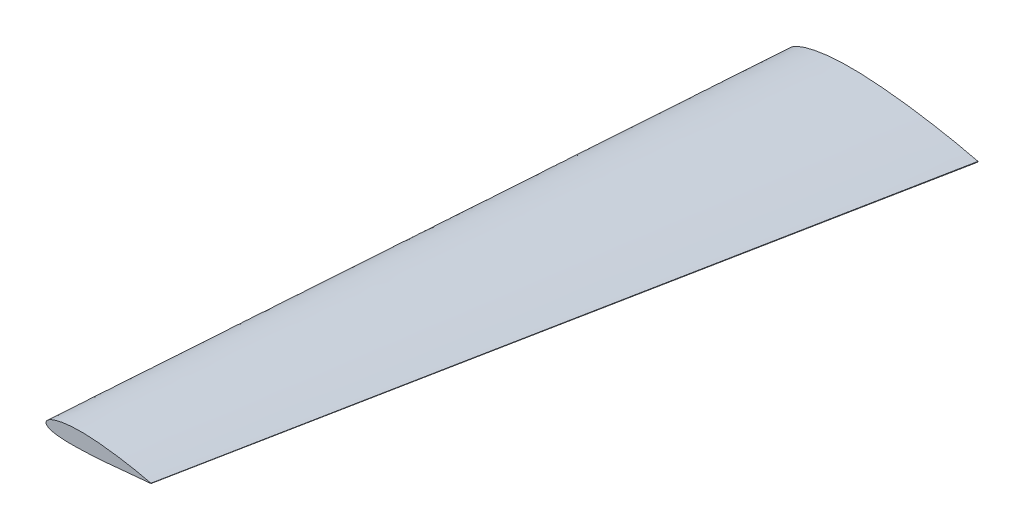
ISO-10303-21;
HEADER;
FILE_DESCRIPTION(('STEP AP214'),'2;1');
FILE_NAME('part.step','',(''),(''),'','','');
FILE_SCHEMA(('AUTOMOTIVE_DESIGN { 1 0 10303 214 1 1 1 1 }'));
ENDSEC;
DATA;
#1=APPLICATION_CONTEXT('core data for automotive mechanical design processes');
#2=APPLICATION_PROTOCOL_DEFINITION('international standard','automotive_design',2000,#1);
#3=PRODUCT_CONTEXT('',#1,'mechanical');
#4=PRODUCT('Part','Part','',(#3));
#5=PRODUCT_RELATED_PRODUCT_CATEGORY('part','',(#4));
#6=PRODUCT_DEFINITION_FORMATION('','',#4);
#7=PRODUCT_DEFINITION_CONTEXT('part definition',#1,'design');
#8=PRODUCT_DEFINITION('design','',#6,#7);
#9=PRODUCT_DEFINITION_SHAPE('','',#8);
#10=(LENGTH_UNIT() NAMED_UNIT(*) SI_UNIT(.MILLI.,.METRE.));
#11=(NAMED_UNIT(*) PLANE_ANGLE_UNIT() SI_UNIT($,.RADIAN.));
#12=(NAMED_UNIT(*) SI_UNIT($,.STERADIAN.) SOLID_ANGLE_UNIT());
#13=UNCERTAINTY_MEASURE_WITH_UNIT(LENGTH_MEASURE(1.E-05),#10,'distance_accuracy_value','');
#14=(GEOMETRIC_REPRESENTATION_CONTEXT(3) GLOBAL_UNCERTAINTY_ASSIGNED_CONTEXT((#13)) GLOBAL_UNIT_ASSIGNED_CONTEXT((#10,
#11,#12)) REPRESENTATION_CONTEXT('',''));
#15=CARTESIAN_POINT('',(0.,0.,0.));
#16=DIRECTION('',(0.,0.,1.));
#17=DIRECTION('',(1.,0.,0.));
#18=AXIS2_PLACEMENT_3D('',#15,#16,#17);
#19=CARTESIAN_POINT('',(0.48529419488582,365.778243503538,4397.25));
#20=DIRECTION('',(0.,0.,-1.));
#21=DIRECTION('',(-1.,0.,0.));
#22=AXIS2_PLACEMENT_3D('',#19,#20,#21);
#23=PLANE('',#22);
#24=CARTESIAN_POINT('',(622.134000000001,361.154223854971,4397.25));
#25=CARTESIAN_POINT('',(621.59500734069,361.291859580465,4397.25));
#26=CARTESIAN_POINT('',(619.381494170329,361.857096389966,4397.25));
#27=CARTESIAN_POINT('',(614.378129432396,363.041959537774,4397.25));
#28=CARTESIAN_POINT('',(606.075965268699,365.041083084075,4397.25));
#29=CARTESIAN_POINT('',(594.562264688442,367.717976295112,4397.25));
#30=CARTESIAN_POINT('',(579.962372665304,371.020420206426,4397.25));
#31=CARTESIAN_POINT('',(562.428500263694,374.855164539315,4397.25));
#32=CARTESIAN_POINT('',(542.135841126099,379.082208316108,4397.25));
#33=CARTESIAN_POINT('',(519.304194537753,383.62313166061,4397.25));
#34=CARTESIAN_POINT('',(494.169690467529,388.330326508768,4397.25));
#35=CARTESIAN_POINT('',(467.003877408074,393.100479443047,4397.25));
#36=CARTESIAN_POINT('',(438.094281483804,397.79844159247,4397.25));
#37=CARTESIAN_POINT('',(407.756068130465,402.314610897269,4397.25));
#38=CARTESIAN_POINT('',(376.319826163633,406.523489806815,4397.25));
#39=CARTESIAN_POINT('',(344.131445540233,410.303703800402,4397.25));
#40=CARTESIAN_POINT('',(311.544482249428,413.555543350783,4397.25));
#41=CARTESIAN_POINT('',(278.910738081519,416.139019252054,4397.25));
#42=CARTESIAN_POINT('',(246.501883794256,418.018501255716,4397.25));
#43=CARTESIAN_POINT('',(214.670723074633,418.896439526605,4397.25));
#44=CARTESIAN_POINT('',(183.801726544895,418.655393508333,4397.25));
#45=CARTESIAN_POINT('',(154.355746136456,417.28073558469,4397.25));
#46=CARTESIAN_POINT('',(126.687396080654,414.815292792805,4397.25));
#47=CARTESIAN_POINT('',(101.122470154931,411.297841187899,4397.25));
#48=CARTESIAN_POINT('',(77.9562016397153,406.856899629141,4397.25));
#49=CARTESIAN_POINT('',(57.4552363090071,401.589993813645,4397.25));
#50=CARTESIAN_POINT('',(39.8290080744428,395.684888103957,4397.25));
#51=CARTESIAN_POINT('',(25.261931616876,389.262183209037,4397.25));
#52=CARTESIAN_POINT('',(13.8438969541932,382.491049697927,4397.25));
#53=CARTESIAN_POINT('',(5.62698924721451,375.445923983102,4397.25));
#54=CARTESIAN_POINT('',(0.604435184205734,368.009060610981,4397.25));
#55=CARTESIAN_POINT('',(-0.636500063416992,360.113178532751,4397.25));
#56=CARTESIAN_POINT('',(2.14402148250149,352.638117238405,4397.25));
#57=CARTESIAN_POINT('',(8.44622146363984,346.322275084812,4397.25));
#58=CARTESIAN_POINT('',(17.7212545167051,340.955489601626,4397.25));
#59=CARTESIAN_POINT('',(29.9494081327897,336.346258667545,4397.25));
#60=CARTESIAN_POINT('',(45.0565133443111,332.488254081348,4397.25));
#61=CARTESIAN_POINT('',(62.9110788027417,329.393215308733,4397.25));
#62=CARTESIAN_POINT('',(83.3338784297079,327.08523582686,4397.25));
#63=CARTESIAN_POINT('',(106.114763475348,325.541414517062,4397.25));
#64=CARTESIAN_POINT('',(131.020950152935,324.734956705274,4397.25));
#65=CARTESIAN_POINT('',(157.805963808211,324.601804228612,4397.25));
#66=CARTESIAN_POINT('',(186.202065047431,325.066195101839,4397.25));
#67=CARTESIAN_POINT('',(215.928239761478,326.025854938204,4397.25));
#68=CARTESIAN_POINT('',(246.78699261797,327.346889225526,4397.25));
#69=CARTESIAN_POINT('',(278.467503295217,328.994699280183,4397.25));
#70=CARTESIAN_POINT('',(310.630418049569,331.06306279554,4397.25));
#71=CARTESIAN_POINT('',(342.834860633464,333.395585555775,4397.25));
#72=CARTESIAN_POINT('',(374.727891467102,335.91471924947,4397.25));
#73=CARTESIAN_POINT('',(405.961174465272,338.533676442493,4397.25));
#74=CARTESIAN_POINT('',(436.19488514861,341.158037465301,4397.25));
#75=CARTESIAN_POINT('',(465.093533598237,343.768700884619,4397.25));
#76=CARTESIAN_POINT('',(492.338921832885,346.282075916507,4397.25));
#77=CARTESIAN_POINT('',(517.626020302118,348.67571927573,4397.25));
#78=CARTESIAN_POINT('',(540.669451546228,350.901365867549,4397.25));
#79=CARTESIAN_POINT('',(561.20651410182,352.917412210596,4397.25));
#80=CARTESIAN_POINT('',(579.003070445572,354.709565594612,4397.25));
#81=CARTESIAN_POINT('',(593.854850006364,356.233965189002,4397.25));
#82=CARTESIAN_POINT('',(605.591915731104,357.456417762401,4397.25));
#83=CARTESIAN_POINT('',(614.073959695485,358.343447162141,4397.25));
#84=CARTESIAN_POINT('',(619.223982636951,358.898590208694,4397.25));
#85=CARTESIAN_POINT('',(621.536730102601,359.138711479412,4397.25));
#86=CARTESIAN_POINT('',(622.134000000001,359.200723094971,4397.25));
#87=B_SPLINE_CURVE_WITH_KNOTS('',3,(#24,#25,#26,#27,#28,#29,#30,#31,#32,#33,#34,#35,#36,#37,#38,
#39,#40,#41,#42,#43,#44,#45,#46,#47,#48,#49,#50,#51,#52,#53,#54,#55,#56,#57,#58,#59,#60,#61,#62,
#63,#64,#65,#66,#67,#68,#69,#70,#71,#72,#73,#74,#75,#76,#77,#78,#79,#80,#81,#82,#83,#84,#85,
#86),.UNSPECIFIED.,.F.,.F.,(4,1,1,1,1,1,1,1,1,1,1,1,1,1,1,1,1,1,1,1,1,1,1,1,1,1,1,1,1,1,1,1,1,1,
1,1,1,1,1,1,1,1,1,1,1,1,1,1,1,1,1,1,1,1,1,1,1,1,1,1,4),(0.,0.00130334450771466,
0.00535252230899535,0.0120463391317453,0.0213110944502395,0.0330476223945204,0.0471172151209095,
0.0633625080701345,0.0816121152043148,0.101657457251514,0.123273921483703,0.146232520323734,
0.170277757132092,0.195135791457301,0.220540260457298,0.246208390086661,0.271859817624248,
0.297233649675704,0.32226027454309,0.346452957899317,0.369543630541379,0.391307275518129,
0.411513240657824,0.429980366745658,0.446542667033163,0.461070388848797,0.473485741632755,
0.483779538851851,0.492063936444463,0.498681587764252,0.504376592822902,0.510069862803764,
0.516664638096755,0.524877655219017,0.535024568512073,0.547190470696628,0.561360064127825,
0.577448521055753,0.595323849545366,0.61484313654323,0.635823685513443,0.658074561029986,
0.681378870254446,0.705504985620235,0.730440423602308,0.755703478300476,0.78101527468104,
0.806090940754041,0.830659549821916,0.854449960993451,0.877193251088143,0.898643274073506,
0.918555547337279,0.93670444520541,0.952884105716393,0.96690411005101,0.978611737935814,
0.987863880462776,0.994552223257594,0.998593104909067,1.),.UNSPECIFIED.);
#88=CARTESIAN_POINT('',(622.134000000001,361.154223854971,4397.25));
#89=VERTEX_POINT('',#88);
#90=CARTESIAN_POINT('',(622.134000000001,359.200723094971,4397.25));
#91=VERTEX_POINT('',#90);
#92=EDGE_CURVE('E52',#89,#91,#87,.T.);
#93=ORIENTED_EDGE('',*,*,#92,.T.);
#94=DIRECTION('',(0.,1.,0.));
#95=VECTOR('',#94,1.);
#96=CARTESIAN_POINT('',(622.134000000001,361.154223854971,4397.25));
#97=LINE('',#96,#95);
#98=EDGE_CURVE('E11',#91,#89,#97,.T.);
#99=ORIENTED_EDGE('',*,*,#98,.T.);
#100=EDGE_LOOP('',(#93,#99));
#101=FACE_BOUND('',#100,.T.);
#102=ADVANCED_FACE('F44',(#101),#23,.F.);
#103=CARTESIAN_POINT('',(1.00720176976186,74.3505883087628,0.));
#104=DIRECTION('',(0.,0.,-1.));
#105=DIRECTION('',(-1.,0.,0.));
#106=AXIS2_PLACEMENT_3D('',#103,#104,#105);
#107=PLANE('',#106);
#108=CARTESIAN_POINT('',(1125.60000008316,65.9855114615369,0.));
#109=CARTESIAN_POINT('',(1124.62493610033,66.2345011951852,0.));
#110=CARTESIAN_POINT('',(1120.62058292286,67.2570421244445,0.));
#111=CARTESIAN_POINT('',(1111.56925232558,69.4005172906733,0.));
#112=CARTESIAN_POINT('',(1096.55023283479,73.0170291921939,0.));
#113=CARTESIAN_POINT('',(1075.721387486,77.8596594411989,0.));
#114=CARTESIAN_POINT('',(1049.30947144394,83.8339413866387,0.));
#115=CARTESIAN_POINT('',(1017.58984194056,90.7711807307702,0.));
#116=CARTESIAN_POINT('',(980.879432811321,98.4181088835122,0.));
#117=CARTESIAN_POINT('',(939.57587167282,106.63286046786,0.));
#118=CARTESIAN_POINT('',(894.106329144065,115.148405303814,0.));
#119=CARTESIAN_POINT('',(844.962049679306,123.777844385162,0.));
#120=CARTESIAN_POINT('',(792.663182047181,132.276686819246,0.));
#121=CARTESIAN_POINT('',(737.779875877223,140.446657139644,0.));
#122=CARTESIAN_POINT('',(680.91018244458,148.060724162462,0.));
#123=CARTESIAN_POINT('',(622.679833534637,154.899315465835,0.));
#124=CARTESIAN_POINT('',(563.728429158624,160.782051656676,0.));
#125=CARTESIAN_POINT('',(504.692395896556,165.455685440603,0.));
#126=CARTESIAN_POINT('',(446.063199386218,168.855759962017,0.));
#127=CARTESIAN_POINT('',(388.479078687565,170.443993071143,0.));
#128=CARTESIAN_POINT('',(332.635559889365,170.007929079247,0.));
#129=CARTESIAN_POINT('',(279.366346590319,167.521105915879,0.));
#130=CARTESIAN_POINT('',(229.312953213314,163.060999777934,0.));
#131=CARTESIAN_POINT('',(183.064756575878,156.697758438646,0.));
#132=CARTESIAN_POINT('',(141.15584806739,148.663878776272,0.));
#133=CARTESIAN_POINT('',(104.068602885197,139.135789528774,0.));
#134=CARTESIAN_POINT('',(72.1818971800078,128.453165576725,0.));
#135=CARTESIAN_POINT('',(45.8293460949968,116.834179478837,0.));
#136=CARTESIAN_POINT('',(25.1735650523651,104.584869037258,0.));
#137=CARTESIAN_POINT('',(10.3087786458589,91.8398933490293,0.));
#138=CARTESIAN_POINT('',(1.22273362452474,78.3862451515384,0.));
#139=CARTESIAN_POINT('',(-1.02217870235349,64.1022097492458,0.));
#140=CARTESIAN_POINT('',(4.00792025368857,50.5794596492748,0.));
#141=CARTESIAN_POINT('',(15.4089070910052,39.1537934572807,0.));
#142=CARTESIAN_POINT('',(32.1878938051928,29.4450170243482,0.));
#143=CARTESIAN_POINT('',(54.3092195071558,21.1066936822002,0.));
#144=CARTESIAN_POINT('',(81.6387089206925,14.1273754064891,0.));
#145=CARTESIAN_POINT('',(113.938487789469,8.5282994626642,0.));
#146=CARTESIAN_POINT('',(150.884327405009,4.35305212484888,0.));
#147=CARTESIAN_POINT('',(192.096058439424,1.5602041535287,0.));
#148=CARTESIAN_POINT('',(237.152563680253,0.101282677764769,0.));
#149=CARTESIAN_POINT('',(285.607958468597,-0.139596640303496,0.));
#150=CARTESIAN_POINT('',(336.977889195705,0.700509076570266,0.));
#151=CARTESIAN_POINT('',(390.753987645918,2.43658047948342,0.));
#152=CARTESIAN_POINT('',(446.578975140098,4.82639587196199,0.));
#153=CARTESIAN_POINT('',(503.89056257175,7.80736454953057,0.));
#154=CARTESIAN_POINT('',(562.074842483772,11.5491349287549,0.));
#155=CARTESIAN_POINT('',(620.334248262862,15.7687822529855,0.));
#156=CARTESIAN_POINT('',(678.030295012358,20.3260178483669,0.));
#157=CARTESIAN_POINT('',(734.532825781623,25.0638390178817,0.));
#158=CARTESIAN_POINT('',(789.227081529709,29.8114359787759,0.));
#159=CARTESIAN_POINT('',(841.506144646797,34.5342533075489,0.));
#160=CARTESIAN_POINT('',(890.794379480738,39.0810712031329,0.));
#161=CARTESIAN_POINT('',(936.539972712385,43.4112886690043,0.));
#162=CARTESIAN_POINT('',(978.226662612258,47.4375917970844,0.));
#163=CARTESIAN_POINT('',(1015.37920943308,51.0847178624718,0.));
#164=CARTESIAN_POINT('',(1047.57404698694,54.3268106559046,0.));
#165=CARTESIAN_POINT('',(1074.4416398577,57.0845237977379,0.));
#166=CARTESIAN_POINT('',(1095.67456363622,59.2960000663866,0.));
#167=CARTESIAN_POINT('',(1111.01899445099,60.9006794705665,0.));
#168=CARTESIAN_POINT('',(1120.33563688431,61.9049602908383,0.));
#169=CARTESIAN_POINT('',(1124.5195097371,62.3393513693517,0.));
#170=CARTESIAN_POINT('',(1125.60000008316,62.451533403382,0.));
#171=B_SPLINE_CURVE_WITH_KNOTS('',3,(#108,#109,#110,#111,#112,#113,#114,#115,#116,#117,#118,
#119,#120,#121,#122,#123,#124,#125,#126,#127,#128,#129,#130,#131,#132,#133,#134,#135,#136,#137,
#138,#139,#140,#141,#142,#143,#144,#145,#146,#147,#148,#149,#150,#151,#152,#153,#154,#155,#156,
#157,#158,#159,#160,#161,#162,#163,#164,#165,#166,#167,#168,#169,#170),.UNSPECIFIED.,.F.,.F.,(4,
1,1,1,1,1,1,1,1,1,1,1,1,1,1,1,1,1,1,1,1,1,1,1,1,1,1,1,1,1,1,1,1,1,1,1,1,1,1,1,1,1,1,1,1,1,1,1,1,
1,1,1,1,1,1,1,1,1,1,1,4),(0.,0.00130334450771466,0.00535252230899535,0.0120463391317453,
0.0213110944502395,0.0330476223945204,0.0471172151209095,0.0633625080701345,0.0816121152043148,
0.101657457251514,0.123273921483703,0.146232520323734,0.170277757132092,0.195135791457301,
0.220540260457298,0.246208390086661,0.271859817624248,0.297233649675704,0.32226027454309,
0.346452957899317,0.369543630541379,0.391307275518129,0.411513240657824,0.429980366745658,
0.446542667033163,0.461070388848797,0.473485741632755,0.483779538851851,0.492063936444463,
0.498681587764252,0.504376592822902,0.510069862803764,0.516664638096755,0.524877655219017,
0.535024568512073,0.547190470696628,0.561360064127825,0.577448521055753,0.595323849545366,
0.61484313654323,0.635823685513443,0.658074561029986,0.681378870254446,0.705504985620235,
0.730440423602308,0.755703478300476,0.78101527468104,0.806090940754041,0.830659549821916,
0.854449960993451,0.877193251088143,0.898643274073506,0.918555547337279,0.93670444520541,
0.952884105716393,0.96690411005101,0.978611737935814,0.987863880462776,0.994552223257594,
0.998593104909067,1.),.UNSPECIFIED.);
#172=CARTESIAN_POINT('',(1125.60000008316,65.985511461537,0.));
#173=VERTEX_POINT('',#172);
#174=CARTESIAN_POINT('',(1125.60000008316,62.451533403382,0.));
#175=VERTEX_POINT('',#174);
#176=EDGE_CURVE('E74',#173,#175,#171,.T.);
#177=ORIENTED_EDGE('',*,*,#176,.F.);
#178=DIRECTION('',(0.,1.,0.));
#179=VECTOR('',#178,1.);
#180=CARTESIAN_POINT('',(1125.60000008316,65.985511461537,0.));
#181=LINE('',#180,#179);
#182=EDGE_CURVE('E77',#175,#173,#181,.T.);
#183=ORIENTED_EDGE('',*,*,#182,.F.);
#184=EDGE_LOOP('',(#177,#183));
#185=FACE_BOUND('',#184,.T.);
#186=ADVANCED_FACE('F83',(#185),#107,.T.);
#187=CARTESIAN_POINT('',(1111.03515795961,0.,127.208693371922));
#188=DIRECTION('',(-0.993509121650301,0.,-0.113752473369358));
#189=DIRECTION('',(-0.113752473369358,0.,0.993509121650301));
#190=AXIS2_PLACEMENT_3D('',#187,#188,#189);
#191=PLANE('',#190);
#192=DIRECTION('',(-0.113500353439415,0.0665422355737592,0.991307117221487));
#193=VECTOR('',#192,1.);
#194=CARTESIAN_POINT('',(1125.60000008316,65.985511461537,0.));
#195=LINE('',#194,#193);
#196=EDGE_CURVE('E70',#173,#89,#195,.T.);
#197=ORIENTED_EDGE('',*,*,#196,.T.);
#198=ORIENTED_EDGE('',*,*,#98,.F.);
#199=DIRECTION('',(-0.113497655354569,0.0668969448836675,0.991283552266579));
#200=VECTOR('',#199,1.);
#201=CARTESIAN_POINT('',(1125.60000008316,62.451533403382,0.));
#202=LINE('',#201,#200);
#203=EDGE_CURVE('E59',#175,#91,#202,.T.);
#204=ORIENTED_EDGE('',*,*,#203,.F.);
#205=ORIENTED_EDGE('',*,*,#182,.T.);
#206=EDGE_LOOP('',(#197,#198,#204,#205));
#207=FACE_BOUND('',#206,.T.);
#208=ADVANCED_FACE('F79',(#207),#191,.F.);
#209=CARTESIAN_POINT('',(1125.60000008316,65.9855114615369,0.));
#210=CARTESIAN_POINT('',(622.134000000001,361.154223854971,4397.25));
#211=CARTESIAN_POINT('',(1124.62493610033,66.2345011951852,0.));
#212=CARTESIAN_POINT('',(621.59500734069,361.291859580465,4397.25));
#213=CARTESIAN_POINT('',(1120.62058292286,67.2570421244445,0.));
#214=CARTESIAN_POINT('',(619.381494170329,361.857096389966,4397.25));
#215=CARTESIAN_POINT('',(1111.56925232558,69.4005172906733,0.));
#216=CARTESIAN_POINT('',(614.378129432396,363.041959537774,4397.25));
#217=CARTESIAN_POINT('',(1096.55023283479,73.0170291921939,0.));
#218=CARTESIAN_POINT('',(606.075965268699,365.041083084075,4397.25));
#219=CARTESIAN_POINT('',(1075.721387486,77.8596594411989,0.));
#220=CARTESIAN_POINT('',(594.562264688442,367.717976295112,4397.25));
#221=CARTESIAN_POINT('',(1049.30947144394,83.8339413866387,0.));
#222=CARTESIAN_POINT('',(579.962372665304,371.020420206426,4397.25));
#223=CARTESIAN_POINT('',(1017.58984194056,90.7711807307702,0.));
#224=CARTESIAN_POINT('',(562.428500263694,374.855164539315,4397.25));
#225=CARTESIAN_POINT('',(980.879432811321,98.4181088835122,0.));
#226=CARTESIAN_POINT('',(542.135841126099,379.082208316108,4397.25));
#227=CARTESIAN_POINT('',(939.57587167282,106.63286046786,0.));
#228=CARTESIAN_POINT('',(519.304194537753,383.62313166061,4397.25));
#229=CARTESIAN_POINT('',(894.106329144065,115.148405303814,0.));
#230=CARTESIAN_POINT('',(494.169690467529,388.330326508768,4397.25));
#231=CARTESIAN_POINT('',(844.962049679306,123.777844385162,0.));
#232=CARTESIAN_POINT('',(467.003877408074,393.100479443047,4397.25));
#233=CARTESIAN_POINT('',(792.663182047181,132.276686819246,0.));
#234=CARTESIAN_POINT('',(438.094281483804,397.79844159247,4397.25));
#235=CARTESIAN_POINT('',(737.779875877223,140.446657139644,0.));
#236=CARTESIAN_POINT('',(407.756068130465,402.314610897269,4397.25));
#237=CARTESIAN_POINT('',(680.91018244458,148.060724162462,0.));
#238=CARTESIAN_POINT('',(376.319826163633,406.523489806815,4397.25));
#239=CARTESIAN_POINT('',(622.679833534637,154.899315465835,0.));
#240=CARTESIAN_POINT('',(344.131445540233,410.303703800402,4397.25));
#241=CARTESIAN_POINT('',(563.728429158624,160.782051656676,0.));
#242=CARTESIAN_POINT('',(311.544482249428,413.555543350783,4397.25));
#243=CARTESIAN_POINT('',(504.692395896556,165.455685440603,0.));
#244=CARTESIAN_POINT('',(278.910738081519,416.139019252054,4397.25));
#245=CARTESIAN_POINT('',(446.063199386218,168.855759962017,0.));
#246=CARTESIAN_POINT('',(246.501883794256,418.018501255716,4397.25));
#247=CARTESIAN_POINT('',(388.479078687565,170.443993071143,0.));
#248=CARTESIAN_POINT('',(214.670723074633,418.896439526605,4397.25));
#249=CARTESIAN_POINT('',(332.635559889365,170.007929079247,0.));
#250=CARTESIAN_POINT('',(183.801726544895,418.655393508333,4397.25));
#251=CARTESIAN_POINT('',(279.366346590319,167.521105915879,0.));
#252=CARTESIAN_POINT('',(154.355746136456,417.28073558469,4397.25));
#253=CARTESIAN_POINT('',(229.312953213314,163.060999777934,0.));
#254=CARTESIAN_POINT('',(126.687396080654,414.815292792805,4397.25));
#255=CARTESIAN_POINT('',(183.064756575878,156.697758438646,0.));
#256=CARTESIAN_POINT('',(101.122470154931,411.297841187899,4397.25));
#257=CARTESIAN_POINT('',(141.15584806739,148.663878776272,0.));
#258=CARTESIAN_POINT('',(77.9562016397153,406.856899629141,4397.25));
#259=CARTESIAN_POINT('',(104.068602885197,139.135789528774,0.));
#260=CARTESIAN_POINT('',(57.4552363090071,401.589993813645,4397.25));
#261=CARTESIAN_POINT('',(72.1818971800078,128.453165576725,0.));
#262=CARTESIAN_POINT('',(39.8290080744428,395.684888103957,4397.25));
#263=CARTESIAN_POINT('',(45.8293460949968,116.834179478837,0.));
#264=CARTESIAN_POINT('',(25.261931616876,389.262183209037,4397.25));
#265=CARTESIAN_POINT('',(25.1735650523651,104.584869037258,0.));
#266=CARTESIAN_POINT('',(13.8438969541932,382.491049697927,4397.25));
#267=CARTESIAN_POINT('',(10.3087786458589,91.8398933490293,0.));
#268=CARTESIAN_POINT('',(5.62698924721451,375.445923983102,4397.25));
#269=CARTESIAN_POINT('',(1.22273362452474,78.3862451515384,0.));
#270=CARTESIAN_POINT('',(0.604435184205734,368.009060610981,4397.25));
#271=CARTESIAN_POINT('',(-1.02217870235349,64.1022097492458,0.));
#272=CARTESIAN_POINT('',(-0.636500063416992,360.113178532751,4397.25));
#273=CARTESIAN_POINT('',(4.00792025368857,50.5794596492748,0.));
#274=CARTESIAN_POINT('',(2.14402148250149,352.638117238405,4397.25));
#275=CARTESIAN_POINT('',(15.4089070910052,39.1537934572807,0.));
#276=CARTESIAN_POINT('',(8.44622146363984,346.322275084812,4397.25));
#277=CARTESIAN_POINT('',(32.1878938051928,29.4450170243482,0.));
#278=CARTESIAN_POINT('',(17.7212545167051,340.955489601626,4397.25));
#279=CARTESIAN_POINT('',(54.3092195071558,21.1066936822002,0.));
#280=CARTESIAN_POINT('',(29.9494081327897,336.346258667545,4397.25));
#281=CARTESIAN_POINT('',(81.6387089206925,14.1273754064891,0.));
#282=CARTESIAN_POINT('',(45.0565133443111,332.488254081348,4397.25));
#283=CARTESIAN_POINT('',(113.938487789469,8.5282994626642,0.));
#284=CARTESIAN_POINT('',(62.9110788027417,329.393215308733,4397.25));
#285=CARTESIAN_POINT('',(150.884327405009,4.35305212484888,0.));
#286=CARTESIAN_POINT('',(83.3338784297079,327.08523582686,4397.25));
#287=CARTESIAN_POINT('',(192.096058439424,1.5602041535287,0.));
#288=CARTESIAN_POINT('',(106.114763475348,325.541414517062,4397.25));
#289=CARTESIAN_POINT('',(237.152563680253,0.101282677764769,0.));
#290=CARTESIAN_POINT('',(131.020950152935,324.734956705274,4397.25));
#291=CARTESIAN_POINT('',(285.607958468597,-0.139596640303496,0.));
#292=CARTESIAN_POINT('',(157.805963808211,324.601804228612,4397.25));
#293=CARTESIAN_POINT('',(336.977889195705,0.700509076570266,0.));
#294=CARTESIAN_POINT('',(186.202065047431,325.066195101839,4397.25));
#295=CARTESIAN_POINT('',(390.753987645918,2.43658047948342,0.));
#296=CARTESIAN_POINT('',(215.928239761478,326.025854938204,4397.25));
#297=CARTESIAN_POINT('',(446.578975140098,4.82639587196199,0.));
#298=CARTESIAN_POINT('',(246.78699261797,327.346889225526,4397.25));
#299=CARTESIAN_POINT('',(503.89056257175,7.80736454953057,0.));
#300=CARTESIAN_POINT('',(278.467503295217,328.994699280183,4397.25));
#301=CARTESIAN_POINT('',(562.074842483772,11.5491349287549,0.));
#302=CARTESIAN_POINT('',(310.630418049569,331.06306279554,4397.25));
#303=CARTESIAN_POINT('',(620.334248262862,15.7687822529855,0.));
#304=CARTESIAN_POINT('',(342.834860633464,333.395585555775,4397.25));
#305=CARTESIAN_POINT('',(678.030295012358,20.3260178483669,0.));
#306=CARTESIAN_POINT('',(374.727891467102,335.91471924947,4397.25));
#307=CARTESIAN_POINT('',(734.532825781623,25.0638390178817,0.));
#308=CARTESIAN_POINT('',(405.961174465272,338.533676442493,4397.25));
#309=CARTESIAN_POINT('',(789.227081529709,29.8114359787759,0.));
#310=CARTESIAN_POINT('',(436.19488514861,341.158037465301,4397.25));
#311=CARTESIAN_POINT('',(841.506144646797,34.5342533075489,0.));
#312=CARTESIAN_POINT('',(465.093533598237,343.768700884619,4397.25));
#313=CARTESIAN_POINT('',(890.794379480738,39.0810712031329,0.));
#314=CARTESIAN_POINT('',(492.338921832885,346.282075916507,4397.25));
#315=CARTESIAN_POINT('',(936.539972712385,43.4112886690043,0.));
#316=CARTESIAN_POINT('',(517.626020302118,348.67571927573,4397.25));
#317=CARTESIAN_POINT('',(978.226662612258,47.4375917970844,0.));
#318=CARTESIAN_POINT('',(540.669451546228,350.901365867549,4397.25));
#319=CARTESIAN_POINT('',(1015.37920943308,51.0847178624718,0.));
#320=CARTESIAN_POINT('',(561.20651410182,352.917412210596,4397.25));
#321=CARTESIAN_POINT('',(1047.57404698694,54.3268106559046,0.));
#322=CARTESIAN_POINT('',(579.003070445572,354.709565594612,4397.25));
#323=CARTESIAN_POINT('',(1074.4416398577,57.0845237977379,0.));
#324=CARTESIAN_POINT('',(593.854850006364,356.233965189002,4397.25));
#325=CARTESIAN_POINT('',(1095.67456363622,59.2960000663866,0.));
#326=CARTESIAN_POINT('',(605.591915731104,357.456417762401,4397.25));
#327=CARTESIAN_POINT('',(1111.01899445099,60.9006794705665,0.));
#328=CARTESIAN_POINT('',(614.073959695485,358.343447162141,4397.25));
#329=CARTESIAN_POINT('',(1120.33563688431,61.9049602908383,0.));
#330=CARTESIAN_POINT('',(619.223982636951,358.898590208694,4397.25));
#331=CARTESIAN_POINT('',(1124.5195097371,62.3393513693517,0.));
#332=CARTESIAN_POINT('',(621.536730102601,359.138711479412,4397.25));
#333=CARTESIAN_POINT('',(1125.60000008316,62.451533403382,0.));
#334=CARTESIAN_POINT('',(622.134000000001,359.200723094971,4397.25));
#335=B_SPLINE_SURFACE_WITH_KNOTS('',3,1,((#209,#210),(#211,#212),(#213,#214),(#215,#216),(#217,
#218),(#219,#220),(#221,#222),(#223,#224),(#225,#226),(#227,#228),(#229,#230),(#231,#232),(#233,
#234),(#235,#236),(#237,#238),(#239,#240),(#241,#242),(#243,#244),(#245,#246),(#247,#248),(#249,
#250),(#251,#252),(#253,#254),(#255,#256),(#257,#258),(#259,#260),(#261,#262),(#263,#264),(#265,
#266),(#267,#268),(#269,#270),(#271,#272),(#273,#274),(#275,#276),(#277,#278),(#279,#280),(#281,
#282),(#283,#284),(#285,#286),(#287,#288),(#289,#290),(#291,#292),(#293,#294),(#295,#296),(#297,
#298),(#299,#300),(#301,#302),(#303,#304),(#305,#306),(#307,#308),(#309,#310),(#311,#312),(#313,
#314),(#315,#316),(#317,#318),(#319,#320),(#321,#322),(#323,#324),(#325,#326),(#327,#328),(#329,
#330),(#331,#332),(#333,#334)),.UNSPECIFIED.,.F.,.F.,.F.,(4,1,1,1,1,1,1,1,1,1,1,1,1,1,1,1,1,1,1,
1,1,1,1,1,1,1,1,1,1,1,1,1,1,1,1,1,1,1,1,1,1,1,1,1,1,1,1,1,1,1,1,1,1,1,1,1,1,1,1,1,4),(2,2),(0.,
0.00130334450771466,0.00535252230899535,0.0120463391317453,0.0213110944502395,
0.0330476223945204,0.0471172151209095,0.0633625080701345,0.0816121152043148,0.101657457251514,
0.123273921483703,0.146232520323734,0.170277757132092,0.195135791457301,0.220540260457298,
0.246208390086661,0.271859817624248,0.297233649675704,0.32226027454309,0.346452957899317,
0.369543630541379,0.391307275518129,0.411513240657824,0.429980366745658,0.446542667033163,
0.461070388848797,0.473485741632755,0.483779538851851,0.492063936444463,0.498681587764252,
0.504376592822902,0.510069862803764,0.516664638096755,0.524877655219017,0.535024568512073,
0.547190470696628,0.561360064127825,0.577448521055753,0.595323849545366,0.61484313654323,
0.635823685513443,0.658074561029986,0.681378870254446,0.705504985620235,0.730440423602308,
0.755703478300476,0.78101527468104,0.806090940754041,0.830659549821916,0.854449960993451,
0.877193251088143,0.898643274073507,0.918555547337279,0.936704445205411,0.952884105716393,
0.966904110051011,0.978611737935814,0.987863880462776,0.994552223257594,0.998593104909067,1.),
(0.,1.),.UNSPECIFIED.);
#336=ORIENTED_EDGE('',*,*,#176,.T.);
#337=ORIENTED_EDGE('',*,*,#203,.T.);
#338=ORIENTED_EDGE('',*,*,#92,.F.);
#339=ORIENTED_EDGE('',*,*,#196,.F.);
#340=EDGE_LOOP('',(#336,#337,#338,#339));
#341=FACE_BOUND('',#340,.T.);
#342=ADVANCED_FACE('F72',(#341),#335,.T.);
#343=CLOSED_SHELL('',(#102,#186,#208,#342));
#344=MANIFOLD_SOLID_BREP('B2',#343);
#345=ADVANCED_BREP_SHAPE_REPRESENTATION('',(#18,#344),#14);
#346=SHAPE_DEFINITION_REPRESENTATION(#9,#345);
ENDSEC;
END-ISO-10303-21;
